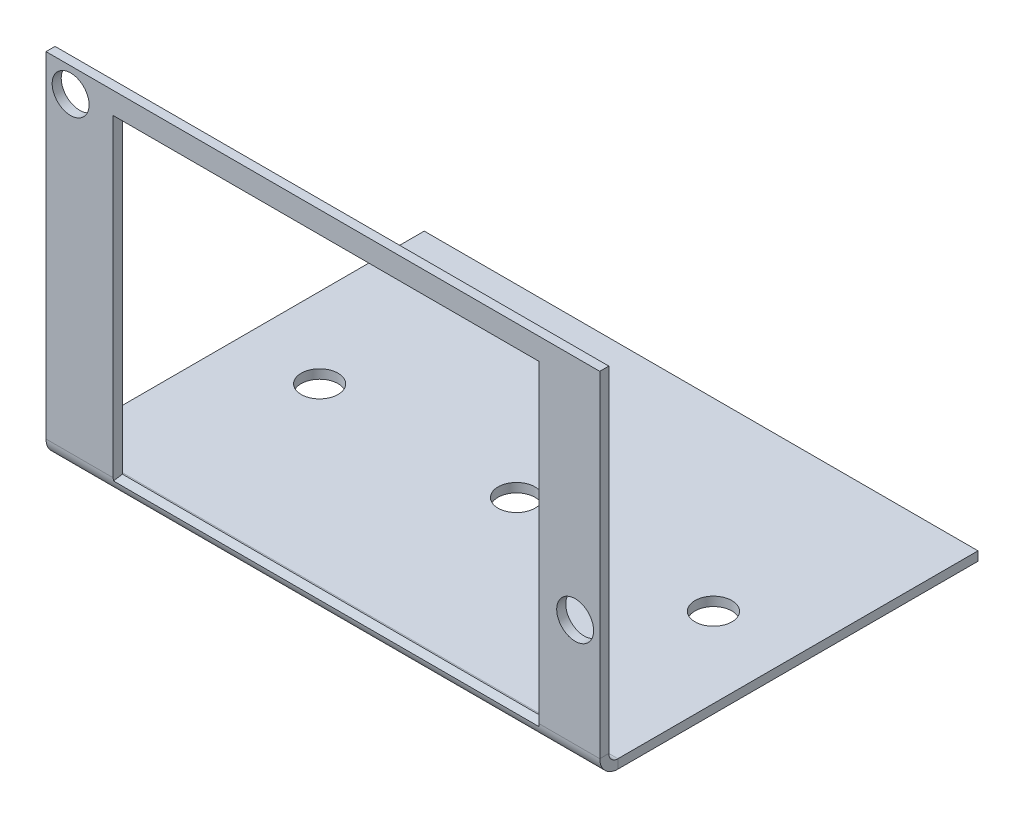
ISO-10303-21;
HEADER;
FILE_DESCRIPTION(('STEP AP214'),'2;1');
FILE_NAME('part.step','',(''),(''),'','','');
FILE_SCHEMA(('AUTOMOTIVE_DESIGN { 1 0 10303 214 1 1 1 1 }'));
ENDSEC;
DATA;
#1=APPLICATION_CONTEXT('core data for automotive mechanical design processes');
#2=APPLICATION_PROTOCOL_DEFINITION('international standard','automotive_design',2000,#1);
#3=PRODUCT_CONTEXT('',#1,'mechanical');
#4=PRODUCT('Part','Part','',(#3));
#5=PRODUCT_RELATED_PRODUCT_CATEGORY('part','',(#4));
#6=PRODUCT_DEFINITION_FORMATION('','',#4);
#7=PRODUCT_DEFINITION_CONTEXT('part definition',#1,'design');
#8=PRODUCT_DEFINITION('design','',#6,#7);
#9=PRODUCT_DEFINITION_SHAPE('','',#8);
#10=(LENGTH_UNIT() NAMED_UNIT(*) SI_UNIT(.MILLI.,.METRE.));
#11=(NAMED_UNIT(*) PLANE_ANGLE_UNIT() SI_UNIT($,.RADIAN.));
#12=(NAMED_UNIT(*) SI_UNIT($,.STERADIAN.) SOLID_ANGLE_UNIT());
#13=UNCERTAINTY_MEASURE_WITH_UNIT(LENGTH_MEASURE(1.E-05),#10,'distance_accuracy_value','');
#14=(GEOMETRIC_REPRESENTATION_CONTEXT(3) GLOBAL_UNCERTAINTY_ASSIGNED_CONTEXT((#13)) GLOBAL_UNIT_ASSIGNED_CONTEXT((#10,
#11,#12)) REPRESENTATION_CONTEXT('',''));
#15=CARTESIAN_POINT('',(0.,0.,0.));
#16=DIRECTION('',(0.,0.,1.));
#17=DIRECTION('',(1.,0.,0.));
#18=AXIS2_PLACEMENT_3D('',#15,#16,#17);
#19=CARTESIAN_POINT('',(22.4999999999999,0.7366,-0.7366));
#20=DIRECTION('',(-1.,0.,0.));
#21=DIRECTION('',(0.,0.,1.));
#22=AXIS2_PLACEMENT_3D('',#19,#20,#21);
#23=CYLINDRICAL_SURFACE('',#22,0.7366);
#24=DIRECTION('',(-1.,0.,0.));
#25=VECTOR('',#24,1.);
#26=CARTESIAN_POINT('',(22.4999999999999,0.7366,0.));
#27=LINE('',#26,#25);
#28=CARTESIAN_POINT('',(-17.0386854365852,0.7366,0.));
#29=VERTEX_POINT('',#28);
#30=CARTESIAN_POINT('',(-22.4999999999999,0.7366,0.));
#31=VERTEX_POINT('',#30);
#32=EDGE_CURVE('E338',#29,#31,#27,.T.);
#33=ORIENTED_EDGE('',*,*,#32,.F.);
#34=CARTESIAN_POINT('',(-17.0386854365852,0.7366,-0.7366));
#35=DIRECTION('',(1.,0.,0.));
#36=DIRECTION('',(0.,0.,1.));
#37=AXIS2_PLACEMENT_3D('',#34,#35,#36);
#38=CIRCLE('',#37,0.7366);
#39=CARTESIAN_POINT('',(-17.0386854365852,0.62129142966162,-0.00908127611275959));
#40=VERTEX_POINT('',#39);
#41=EDGE_CURVE('E209',#29,#40,#38,.T.);
#42=ORIENTED_EDGE('',*,*,#41,.T.);
#43=DIRECTION('',(1.,0.,0.));
#44=VECTOR('',#43,1.);
#45=CARTESIAN_POINT('',(17.5607864810594,0.62129142966162,-0.00908127611275948));
#46=LINE('',#45,#44);
#47=CARTESIAN_POINT('',(17.5607864810594,0.62129142966162,-0.00908127611275948));
#48=VERTEX_POINT('',#47);
#49=EDGE_CURVE('E218',#40,#48,#46,.T.);
#50=ORIENTED_EDGE('',*,*,#49,.T.);
#51=CARTESIAN_POINT('',(17.5607864810594,0.7366,-0.7366));
#52=DIRECTION('',(-1.,0.,0.));
#53=DIRECTION('',(0.,0.,-1.));
#54=AXIS2_PLACEMENT_3D('',#51,#52,#53);
#55=CIRCLE('',#54,0.7366);
#56=CARTESIAN_POINT('',(17.5607864810594,0.7366,0.));
#57=VERTEX_POINT('',#56);
#58=EDGE_CURVE('E180',#48,#57,#55,.T.);
#59=ORIENTED_EDGE('',*,*,#58,.T.);
#60=CARTESIAN_POINT('',(22.4999999999999,0.7366,0.));
#61=VERTEX_POINT('',#60);
#62=EDGE_CURVE('E339',#61,#57,#27,.T.);
#63=ORIENTED_EDGE('',*,*,#62,.F.);
#64=CARTESIAN_POINT('',(22.4999999999999,0.7366,-0.7366));
#65=DIRECTION('',(-1.,0.,0.));
#66=DIRECTION('',(0.,0.,1.));
#67=AXIS2_PLACEMENT_3D('',#64,#65,#66);
#68=CIRCLE('',#67,0.7366);
#69=CARTESIAN_POINT('',(22.4999999999999,0.,-0.7366));
#70=VERTEX_POINT('',#69);
#71=EDGE_CURVE('E274',#61,#70,#68,.F.);
#72=ORIENTED_EDGE('',*,*,#71,.T.);
#73=DIRECTION('',(-1.,0.,0.));
#74=VECTOR('',#73,1.);
#75=CARTESIAN_POINT('',(22.4999999999999,0.,-0.7366));
#76=LINE('',#75,#74);
#77=CARTESIAN_POINT('',(-22.4999999999999,0.,-0.7366));
#78=VERTEX_POINT('',#77);
#79=EDGE_CURVE('E342',#70,#78,#76,.T.);
#80=ORIENTED_EDGE('',*,*,#79,.T.);
#81=CARTESIAN_POINT('',(-22.4999999999999,0.7366,-0.7366));
#82=DIRECTION('',(-1.,0.,0.));
#83=DIRECTION('',(0.,0.,1.));
#84=AXIS2_PLACEMENT_3D('',#81,#82,#83);
#85=CIRCLE('',#84,0.7366);
#86=EDGE_CURVE('E306',#31,#78,#85,.F.);
#87=ORIENTED_EDGE('',*,*,#86,.F.);
#88=EDGE_LOOP('',(#33,#42,#50,#59,#63,#72,#80,#87));
#89=FACE_BOUND('',#88,.T.);
#90=ADVANCED_FACE('F48',(#89),#23,.F.);
#91=CARTESIAN_POINT('',(22.4999999999999,0.,0.));
#92=DIRECTION('',(0.,0.,-1.));
#93=DIRECTION('',(-1.,0.,0.));
#94=AXIS2_PLACEMENT_3D('',#91,#92,#93);
#95=PLANE('',#94);
#96=CARTESIAN_POINT('',(20.4999999999999,9.5,0.));
#97=DIRECTION('',(0.,0.,-1.));
#98=DIRECTION('',(-1.,0.,0.));
#99=AXIS2_PLACEMENT_3D('',#96,#97,#98);
#100=CIRCLE('',#99,1.5);
#101=CARTESIAN_POINT('',(18.9999999999999,9.5,0.));
#102=VERTEX_POINT('',#101);
#103=EDGE_CURVE('E252',#102,#102,#100,.T.);
#104=ORIENTED_EDGE('',*,*,#103,.F.);
#105=EDGE_LOOP('',(#104));
#106=FACE_BOUND('',#105,.T.);
#107=CARTESIAN_POINT('',(-20.5000000000001,26.,0.));
#108=DIRECTION('',(0.,0.,-1.));
#109=DIRECTION('',(-1.,0.,0.));
#110=AXIS2_PLACEMENT_3D('',#107,#108,#109);
#111=CIRCLE('',#110,1.5);
#112=CARTESIAN_POINT('',(-22.0000000000001,26.,0.));
#113=VERTEX_POINT('',#112);
#114=EDGE_CURVE('E235',#113,#113,#111,.T.);
#115=ORIENTED_EDGE('',*,*,#114,.F.);
#116=EDGE_LOOP('',(#115));
#117=FACE_BOUND('',#116,.T.);
#118=DIRECTION('',(-1.,0.,0.));
#119=VECTOR('',#118,1.);
#120=CARTESIAN_POINT('',(-19.7693427182926,26.2317350927219,0.));
#121=LINE('',#120,#119);
#122=CARTESIAN_POINT('',(-17.0386854365852,26.2317350927219,0.));
#123=VERTEX_POINT('',#122);
#124=CARTESIAN_POINT('',(17.5607864810594,26.2317350927219,0.));
#125=VERTEX_POINT('',#124);
#126=EDGE_CURVE('E155',#123,#125,#121,.F.);
#127=ORIENTED_EDGE('',*,*,#126,.F.);
#128=DIRECTION('',(0.,1.,0.));
#129=VECTOR('',#128,1.);
#130=CARTESIAN_POINT('',(-17.0386854365852,-0.131186430737841,0.));
#131=LINE('',#130,#129);
#132=EDGE_CURVE('E213',#29,#123,#131,.T.);
#133=ORIENTED_EDGE('',*,*,#132,.F.);
#134=ORIENTED_EDGE('',*,*,#32,.T.);
#135=DIRECTION('',(0.,-1.,0.));
#136=VECTOR('',#135,1.);
#137=CARTESIAN_POINT('',(-22.4999999999999,0.,0.));
#138=LINE('',#137,#136);
#139=CARTESIAN_POINT('',(-22.4999999999999,28.,0.));
#140=VERTEX_POINT('',#139);
#141=EDGE_CURVE('E310',#140,#31,#138,.T.);
#142=ORIENTED_EDGE('',*,*,#141,.F.);
#143=DIRECTION('',(-1.,0.,0.));
#144=VECTOR('',#143,1.);
#145=CARTESIAN_POINT('',(22.4999999999999,28.,0.));
#146=LINE('',#145,#144);
#147=CARTESIAN_POINT('',(22.4999999999999,28.,0.));
#148=VERTEX_POINT('',#147);
#149=EDGE_CURVE('E335',#148,#140,#146,.T.);
#150=ORIENTED_EDGE('',*,*,#149,.F.);
#151=DIRECTION('',(0.,-1.,0.));
#152=VECTOR('',#151,1.);
#153=CARTESIAN_POINT('',(22.4999999999999,0.,0.));
#154=LINE('',#153,#152);
#155=EDGE_CURVE('E278',#148,#61,#154,.T.);
#156=ORIENTED_EDGE('',*,*,#155,.T.);
#157=ORIENTED_EDGE('',*,*,#62,.T.);
#158=DIRECTION('',(0.,1.,0.));
#159=VECTOR('',#158,1.);
#160=CARTESIAN_POINT('',(17.5607864810594,-0.131186430737841,0.));
#161=LINE('',#160,#159);
#162=EDGE_CURVE('E174',#125,#57,#161,.F.);
#163=ORIENTED_EDGE('',*,*,#162,.F.);
#164=EDGE_LOOP('',(#127,#133,#134,#142,#150,#156,#157,#163));
#165=FACE_BOUND('',#164,.T.);
#166=ADVANCED_FACE('F372',(#106,#117,#165),#95,.T.);
#167=CARTESIAN_POINT('',(22.4999999999999,0.,0.7366));
#168=DIRECTION('',(0.,0.,-1.));
#169=DIRECTION('',(-1.,0.,0.));
#170=AXIS2_PLACEMENT_3D('',#167,#168,#169);
#171=PLANE('',#170);
#172=CARTESIAN_POINT('',(-20.5000000000001,26.,0.7366));
#173=DIRECTION('',(0.,0.,-1.));
#174=DIRECTION('',(-1.,0.,0.));
#175=AXIS2_PLACEMENT_3D('',#172,#173,#174);
#176=CIRCLE('',#175,1.5);
#177=CARTESIAN_POINT('',(-22.0000000000001,26.,0.7366));
#178=VERTEX_POINT('',#177);
#179=EDGE_CURVE('E256',#178,#178,#176,.T.);
#180=ORIENTED_EDGE('',*,*,#179,.T.);
#181=EDGE_LOOP('',(#180));
#182=FACE_BOUND('',#181,.T.);
#183=CARTESIAN_POINT('',(20.4999999999999,9.5,0.7366));
#184=DIRECTION('',(0.,0.,-1.));
#185=DIRECTION('',(-1.,0.,0.));
#186=AXIS2_PLACEMENT_3D('',#183,#184,#185);
#187=CIRCLE('',#186,1.5);
#188=CARTESIAN_POINT('',(18.9999999999999,9.5,0.7366));
#189=VERTEX_POINT('',#188);
#190=EDGE_CURVE('E247',#189,#189,#187,.T.);
#191=ORIENTED_EDGE('',*,*,#190,.T.);
#192=EDGE_LOOP('',(#191));
#193=FACE_BOUND('',#192,.T.);
#194=DIRECTION('',(0.,1.,0.));
#195=VECTOR('',#194,1.);
#196=CARTESIAN_POINT('',(-17.0386854365852,0.562922821678405,0.7366));
#197=LINE('',#196,#195);
#198=CARTESIAN_POINT('',(-17.0386854365852,0.7366,0.7366));
#199=VERTEX_POINT('',#198);
#200=CARTESIAN_POINT('',(-17.0386854365852,26.2317350927219,0.7366));
#201=VERTEX_POINT('',#200);
#202=EDGE_CURVE('E169',#199,#201,#197,.T.);
#203=ORIENTED_EDGE('',*,*,#202,.T.);
#204=DIRECTION('',(1.,0.,0.));
#205=VECTOR('',#204,1.);
#206=CARTESIAN_POINT('',(-17.0386854365852,26.2317350927219,0.7366));
#207=LINE('',#206,#205);
#208=CARTESIAN_POINT('',(17.5607864810594,26.2317350927219,0.7366));
#209=VERTEX_POINT('',#208);
#210=EDGE_CURVE('E152',#201,#209,#207,.T.);
#211=ORIENTED_EDGE('',*,*,#210,.T.);
#212=DIRECTION('',(0.,-1.,0.));
#213=VECTOR('',#212,1.);
#214=CARTESIAN_POINT('',(17.5607864810594,26.2317350927219,0.7366));
#215=LINE('',#214,#213);
#216=CARTESIAN_POINT('',(17.5607864810594,0.7366,0.7366));
#217=VERTEX_POINT('',#216);
#218=EDGE_CURVE('E161',#209,#217,#215,.T.);
#219=ORIENTED_EDGE('',*,*,#218,.T.);
#220=DIRECTION('',(-1.,0.,0.));
#221=VECTOR('',#220,1.);
#222=CARTESIAN_POINT('',(22.4999999999999,0.7366,0.7366));
#223=LINE('',#222,#221);
#224=CARTESIAN_POINT('',(22.4999999999999,0.7366,0.7366));
#225=VERTEX_POINT('',#224);
#226=EDGE_CURVE('E329',#225,#217,#223,.T.);
#227=ORIENTED_EDGE('',*,*,#226,.F.);
#228=DIRECTION('',(0.,1.,0.));
#229=VECTOR('',#228,1.);
#230=CARTESIAN_POINT('',(22.4999999999999,0.,0.7366));
#231=LINE('',#230,#229);
#232=CARTESIAN_POINT('',(22.4999999999999,28.,0.7366));
#233=VERTEX_POINT('',#232);
#234=EDGE_CURVE('E286',#233,#225,#231,.F.);
#235=ORIENTED_EDGE('',*,*,#234,.F.);
#236=DIRECTION('',(-1.,0.,0.));
#237=VECTOR('',#236,1.);
#238=CARTESIAN_POINT('',(22.4999999999999,28.,0.7366));
#239=LINE('',#238,#237);
#240=CARTESIAN_POINT('',(-22.4999999999999,28.,0.7366));
#241=VERTEX_POINT('',#240);
#242=EDGE_CURVE('E332',#233,#241,#239,.T.);
#243=ORIENTED_EDGE('',*,*,#242,.T.);
#244=DIRECTION('',(0.,1.,0.));
#245=VECTOR('',#244,1.);
#246=CARTESIAN_POINT('',(-22.4999999999999,0.,0.7366));
#247=LINE('',#246,#245);
#248=CARTESIAN_POINT('',(-22.4999999999999,0.7366,0.7366));
#249=VERTEX_POINT('',#248);
#250=EDGE_CURVE('E318',#241,#249,#247,.F.);
#251=ORIENTED_EDGE('',*,*,#250,.T.);
#252=EDGE_CURVE('E328',#199,#249,#223,.T.);
#253=ORIENTED_EDGE('',*,*,#252,.F.);
#254=EDGE_LOOP('',(#203,#211,#219,#227,#235,#243,#251,#253));
#255=FACE_BOUND('',#254,.T.);
#256=ADVANCED_FACE('F171',(#182,#193,#255),#171,.F.);
#257=CARTESIAN_POINT('',(22.4999999999999,0.7366,-0.7366));
#258=DIRECTION('',(-1.,0.,0.));
#259=DIRECTION('',(0.,0.,1.));
#260=AXIS2_PLACEMENT_3D('',#257,#258,#259);
#261=CYLINDRICAL_SURFACE('',#260,1.4732);
#262=CARTESIAN_POINT('',(-17.0386854365852,0.7366,-0.7366));
#263=DIRECTION('',(-1.,0.,0.));
#264=DIRECTION('',(0.,0.,1.));
#265=AXIS2_PLACEMENT_3D('',#262,#263,#264);
#266=CIRCLE('',#265,1.4732);
#267=CARTESIAN_POINT('',(-17.0386854365852,0.505982859323239,0.718437447774481));
#268=VERTEX_POINT('',#267);
#269=EDGE_CURVE('E199',#199,#268,#266,.F.);
#270=ORIENTED_EDGE('',*,*,#269,.F.);
#271=ORIENTED_EDGE('',*,*,#252,.T.);
#272=CARTESIAN_POINT('',(-22.4999999999999,0.7366,-0.7366));
#273=DIRECTION('',(1.,0.,0.));
#274=DIRECTION('',(0.,0.,-1.));
#275=AXIS2_PLACEMENT_3D('',#272,#273,#274);
#276=CIRCLE('',#275,1.4732);
#277=CARTESIAN_POINT('',(-22.4999999999999,-0.7366,-0.7366));
#278=VERTEX_POINT('',#277);
#279=EDGE_CURVE('E267',#249,#278,#276,.T.);
#280=ORIENTED_EDGE('',*,*,#279,.T.);
#281=DIRECTION('',(-1.,0.,0.));
#282=VECTOR('',#281,1.);
#283=CARTESIAN_POINT('',(22.4999999999999,-0.7366,-0.7366));
#284=LINE('',#283,#282);
#285=CARTESIAN_POINT('',(22.4999999999999,-0.7366,-0.7366));
#286=VERTEX_POINT('',#285);
#287=EDGE_CURVE('E294',#286,#278,#284,.T.);
#288=ORIENTED_EDGE('',*,*,#287,.F.);
#289=CARTESIAN_POINT('',(22.4999999999999,0.7366,-0.7366));
#290=DIRECTION('',(1.,0.,0.));
#291=DIRECTION('',(0.,0.,-1.));
#292=AXIS2_PLACEMENT_3D('',#289,#290,#291);
#293=CIRCLE('',#292,1.4732);
#294=EDGE_CURVE('E290',#225,#286,#293,.T.);
#295=ORIENTED_EDGE('',*,*,#294,.F.);
#296=ORIENTED_EDGE('',*,*,#226,.T.);
#297=CARTESIAN_POINT('',(17.5607864810594,0.7366,-0.7366));
#298=DIRECTION('',(-1.,0.,0.));
#299=DIRECTION('',(0.,0.,1.));
#300=AXIS2_PLACEMENT_3D('',#297,#298,#299);
#301=CIRCLE('',#300,1.4732);
#302=CARTESIAN_POINT('',(17.5607864810594,0.505982859323239,0.718437447774481));
#303=VERTEX_POINT('',#302);
#304=EDGE_CURVE('E164',#303,#217,#301,.T.);
#305=ORIENTED_EDGE('',*,*,#304,.F.);
#306=DIRECTION('',(-1.,0.,0.));
#307=VECTOR('',#306,1.);
#308=CARTESIAN_POINT('',(65.069873618499,0.505982859323239,0.718437447774481));
#309=LINE('',#308,#307);
#310=EDGE_CURVE('E72',#268,#303,#309,.F.);
#311=ORIENTED_EDGE('',*,*,#310,.F.);
#312=EDGE_LOOP('',(#270,#271,#280,#288,#295,#296,#305,#311));
#313=FACE_BOUND('',#312,.T.);
#314=ADVANCED_FACE('F382',(#313),#261,.T.);
#315=CARTESIAN_POINT('',(22.4999999999999,0.,-0.7366));
#316=DIRECTION('',(1.,0.,0.));
#317=DIRECTION('',(0.,0.,-1.));
#318=AXIS2_PLACEMENT_3D('',#315,#316,#317);
#319=PLANE('',#318);
#320=DIRECTION('',(0.,-1.,0.));
#321=VECTOR('',#320,1.);
#322=CARTESIAN_POINT('',(22.4999999999999,0.,-0.7366));
#323=LINE('',#322,#321);
#324=EDGE_CURVE('E11',#70,#286,#323,.T.);
#325=ORIENTED_EDGE('',*,*,#324,.F.);
#326=ORIENTED_EDGE('',*,*,#71,.F.);
#327=DIRECTION('',(0.,0.,-1.));
#328=VECTOR('',#327,1.);
#329=CARTESIAN_POINT('',(22.4999999999999,0.7366,0.7366));
#330=LINE('',#329,#328);
#331=EDGE_CURVE('E57',#225,#61,#330,.T.);
#332=ORIENTED_EDGE('',*,*,#331,.F.);
#333=ORIENTED_EDGE('',*,*,#294,.T.);
#334=EDGE_LOOP('',(#325,#326,#332,#333));
#335=FACE_BOUND('',#334,.T.);
#336=ADVANCED_FACE('F50',(#335),#319,.T.);
#337=CARTESIAN_POINT('',(22.4999999999999,0.7366,0.7366));
#338=DIRECTION('',(1.,0.,0.));
#339=DIRECTION('',(0.,0.,-1.));
#340=AXIS2_PLACEMENT_3D('',#337,#338,#339);
#341=PLANE('',#340);
#342=DIRECTION('',(0.,0.,-1.));
#343=VECTOR('',#342,1.);
#344=CARTESIAN_POINT('',(22.4999999999999,0.,0.));
#345=LINE('',#344,#343);
#346=CARTESIAN_POINT('',(22.4999999999999,0.,-30.));
#347=VERTEX_POINT('',#346);
#348=EDGE_CURVE('E270',#70,#347,#345,.T.);
#349=ORIENTED_EDGE('',*,*,#348,.F.);
#350=ORIENTED_EDGE('',*,*,#324,.T.);
#351=DIRECTION('',(0.,0.,-1.));
#352=VECTOR('',#351,1.);
#353=CARTESIAN_POINT('',(22.4999999999999,-0.7366,0.));
#354=LINE('',#353,#352);
#355=CARTESIAN_POINT('',(22.4999999999999,-0.7366,-30.));
#356=VERTEX_POINT('',#355);
#357=EDGE_CURVE('E263',#286,#356,#354,.T.);
#358=ORIENTED_EDGE('',*,*,#357,.T.);
#359=DIRECTION('',(0.,-1.,0.));
#360=VECTOR('',#359,1.);
#361=CARTESIAN_POINT('',(22.4999999999999,0.,-30.));
#362=LINE('',#361,#360);
#363=EDGE_CURVE('E266',#347,#356,#362,.T.);
#364=ORIENTED_EDGE('',*,*,#363,.F.);
#365=EDGE_LOOP('',(#349,#350,#358,#364));
#366=FACE_BOUND('',#365,.T.);
#367=ADVANCED_FACE('F392',(#366),#341,.T.);
#368=CARTESIAN_POINT('',(-22.4999999999999,0.7366,0.));
#369=DIRECTION('',(-1.,0.,0.));
#370=DIRECTION('',(0.,0.,1.));
#371=AXIS2_PLACEMENT_3D('',#368,#369,#370);
#372=PLANE('',#371);
#373=DIRECTION('',(0.,0.,1.));
#374=VECTOR('',#373,1.);
#375=CARTESIAN_POINT('',(-22.4999999999999,0.7366,0.));
#376=LINE('',#375,#374);
#377=EDGE_CURVE('E355',#31,#249,#376,.T.);
#378=ORIENTED_EDGE('',*,*,#377,.F.);
#379=ORIENTED_EDGE('',*,*,#86,.T.);
#380=DIRECTION('',(0.,1.,0.));
#381=VECTOR('',#380,1.);
#382=CARTESIAN_POINT('',(-22.4999999999999,-0.7366,-0.7366));
#383=LINE('',#382,#381);
#384=EDGE_CURVE('E352',#278,#78,#383,.T.);
#385=ORIENTED_EDGE('',*,*,#384,.F.);
#386=ORIENTED_EDGE('',*,*,#279,.F.);
#387=EDGE_LOOP('',(#378,#379,#385,#386));
#388=FACE_BOUND('',#387,.T.);
#389=ADVANCED_FACE('F402',(#388),#372,.T.);
#390=CARTESIAN_POINT('',(-22.4999999999999,-0.7366,-0.7366));
#391=DIRECTION('',(-1.,0.,0.));
#392=DIRECTION('',(0.,0.,1.));
#393=AXIS2_PLACEMENT_3D('',#390,#391,#392);
#394=PLANE('',#393);
#395=ORIENTED_EDGE('',*,*,#141,.T.);
#396=ORIENTED_EDGE('',*,*,#377,.T.);
#397=ORIENTED_EDGE('',*,*,#250,.F.);
#398=DIRECTION('',(0.,0.,-1.));
#399=VECTOR('',#398,1.);
#400=CARTESIAN_POINT('',(-22.4999999999999,28.,0.7366));
#401=LINE('',#400,#399);
#402=EDGE_CURVE('E314',#241,#140,#401,.T.);
#403=ORIENTED_EDGE('',*,*,#402,.T.);
#404=EDGE_LOOP('',(#395,#396,#397,#403));
#405=FACE_BOUND('',#404,.T.);
#406=ADVANCED_FACE('F401',(#405),#394,.T.);
#407=CARTESIAN_POINT('',(22.4999999999999,-0.7366,0.));
#408=DIRECTION('',(0.,1.,0.));
#409=DIRECTION('',(0.,0.,1.));
#410=AXIS2_PLACEMENT_3D('',#407,#408,#409);
#411=PLANE('',#410);
#412=CARTESIAN_POINT('',(16.0000000000001,-0.7366,-15.));
#413=DIRECTION('',(0.,-1.,0.));
#414=DIRECTION('',(0.,0.,1.));
#415=AXIS2_PLACEMENT_3D('',#412,#413,#414);
#416=CIRCLE('',#415,1.5);
#417=CARTESIAN_POINT('',(16.0000000000001,-0.7366,-13.5));
#418=VERTEX_POINT('',#417);
#419=EDGE_CURVE('E223',#418,#418,#416,.T.);
#420=ORIENTED_EDGE('',*,*,#419,.F.);
#421=EDGE_LOOP('',(#420));
#422=FACE_BOUND('',#421,.T.);
#423=CARTESIAN_POINT('',(0.,-0.7366,-15.));
#424=DIRECTION('',(0.,1.,0.));
#425=DIRECTION('',(0.,0.,1.));
#426=AXIS2_PLACEMENT_3D('',#423,#424,#425);
#427=CIRCLE('',#426,1.5);
#428=CARTESIAN_POINT('',(0.,-0.7366,-13.5));
#429=VERTEX_POINT('',#428);
#430=EDGE_CURVE('E231',#429,#429,#427,.T.);
#431=ORIENTED_EDGE('',*,*,#430,.T.);
#432=EDGE_LOOP('',(#431));
#433=FACE_BOUND('',#432,.T.);
#434=CARTESIAN_POINT('',(-16.0000000000001,-0.7366,-15.));
#435=DIRECTION('',(0.,1.,0.));
#436=DIRECTION('',(0.,0.,1.));
#437=AXIS2_PLACEMENT_3D('',#434,#435,#436);
#438=CIRCLE('',#437,1.5);
#439=CARTESIAN_POINT('',(-16.0000000000001,-0.7366,-13.5));
#440=VERTEX_POINT('',#439);
#441=EDGE_CURVE('E240',#440,#440,#438,.T.);
#442=ORIENTED_EDGE('',*,*,#441,.T.);
#443=EDGE_LOOP('',(#442));
#444=FACE_BOUND('',#443,.T.);
#445=DIRECTION('',(0.,0.,-1.));
#446=VECTOR('',#445,1.);
#447=CARTESIAN_POINT('',(-22.4999999999999,-0.7366,0.));
#448=LINE('',#447,#446);
#449=CARTESIAN_POINT('',(-22.4999999999999,-0.7366,-30.));
#450=VERTEX_POINT('',#449);
#451=EDGE_CURVE('E251',#278,#450,#448,.T.);
#452=ORIENTED_EDGE('',*,*,#451,.T.);
#453=DIRECTION('',(-1.,0.,0.));
#454=VECTOR('',#453,1.);
#455=CARTESIAN_POINT('',(22.4999999999999,-0.7366,-30.));
#456=LINE('',#455,#454);
#457=EDGE_CURVE('E349',#356,#450,#456,.T.);
#458=ORIENTED_EDGE('',*,*,#457,.F.);
#459=ORIENTED_EDGE('',*,*,#357,.F.);
#460=ORIENTED_EDGE('',*,*,#287,.T.);
#461=EDGE_LOOP('',(#452,#458,#459,#460));
#462=FACE_BOUND('',#461,.T.);
#463=ADVANCED_FACE('F388',(#422,#433,#444,#462),#411,.F.);
#464=CARTESIAN_POINT('',(22.4999999999999,0.,-30.));
#465=DIRECTION('',(0.,0.,-1.));
#466=DIRECTION('',(-1.,0.,0.));
#467=AXIS2_PLACEMENT_3D('',#464,#465,#466);
#468=PLANE('',#467);
#469=DIRECTION('',(0.,-1.,0.));
#470=VECTOR('',#469,1.);
#471=CARTESIAN_POINT('',(-22.4999999999999,0.,-30.));
#472=LINE('',#471,#470);
#473=CARTESIAN_POINT('',(-22.4999999999999,0.,-30.));
#474=VERTEX_POINT('',#473);
#475=EDGE_CURVE('E298',#474,#450,#472,.T.);
#476=ORIENTED_EDGE('',*,*,#475,.F.);
#477=DIRECTION('',(-1.,0.,0.));
#478=VECTOR('',#477,1.);
#479=CARTESIAN_POINT('',(22.4999999999999,0.,-30.));
#480=LINE('',#479,#478);
#481=EDGE_CURVE('E346',#347,#474,#480,.T.);
#482=ORIENTED_EDGE('',*,*,#481,.F.);
#483=ORIENTED_EDGE('',*,*,#363,.T.);
#484=ORIENTED_EDGE('',*,*,#457,.T.);
#485=EDGE_LOOP('',(#476,#482,#483,#484));
#486=FACE_BOUND('',#485,.T.);
#487=ADVANCED_FACE('F406',(#486),#468,.T.);
#488=CARTESIAN_POINT('',(22.4999999999999,0.,0.));
#489=DIRECTION('',(0.,1.,0.));
#490=DIRECTION('',(0.,0.,1.));
#491=AXIS2_PLACEMENT_3D('',#488,#489,#490);
#492=PLANE('',#491);
#493=CARTESIAN_POINT('',(16.0000000000001,0.,-15.));
#494=DIRECTION('',(0.,-1.,0.));
#495=DIRECTION('',(0.,0.,1.));
#496=AXIS2_PLACEMENT_3D('',#493,#494,#495);
#497=CIRCLE('',#496,1.5);
#498=CARTESIAN_POINT('',(16.0000000000001,0.,-13.5));
#499=VERTEX_POINT('',#498);
#500=EDGE_CURVE('E222',#499,#499,#497,.T.);
#501=ORIENTED_EDGE('',*,*,#500,.T.);
#502=EDGE_LOOP('',(#501));
#503=FACE_BOUND('',#502,.T.);
#504=CARTESIAN_POINT('',(0.,0.,-15.));
#505=DIRECTION('',(0.,1.,0.));
#506=DIRECTION('',(0.,0.,1.));
#507=AXIS2_PLACEMENT_3D('',#504,#505,#506);
#508=CIRCLE('',#507,1.5);
#509=CARTESIAN_POINT('',(0.,0.,-13.5));
#510=VERTEX_POINT('',#509);
#511=EDGE_CURVE('E236',#510,#510,#508,.T.);
#512=ORIENTED_EDGE('',*,*,#511,.F.);
#513=EDGE_LOOP('',(#512));
#514=FACE_BOUND('',#513,.T.);
#515=CARTESIAN_POINT('',(-16.0000000000001,0.,-15.));
#516=DIRECTION('',(0.,1.,0.));
#517=DIRECTION('',(0.,0.,1.));
#518=AXIS2_PLACEMENT_3D('',#515,#516,#517);
#519=CIRCLE('',#518,1.5);
#520=CARTESIAN_POINT('',(-16.0000000000001,0.,-13.5));
#521=VERTEX_POINT('',#520);
#522=EDGE_CURVE('E227',#521,#521,#519,.T.);
#523=ORIENTED_EDGE('',*,*,#522,.F.);
#524=EDGE_LOOP('',(#523));
#525=FACE_BOUND('',#524,.T.);
#526=DIRECTION('',(0.,0.,-1.));
#527=VECTOR('',#526,1.);
#528=CARTESIAN_POINT('',(-22.4999999999999,0.,0.));
#529=LINE('',#528,#527);
#530=EDGE_CURVE('E302',#78,#474,#529,.T.);
#531=ORIENTED_EDGE('',*,*,#530,.F.);
#532=ORIENTED_EDGE('',*,*,#79,.F.);
#533=ORIENTED_EDGE('',*,*,#348,.T.);
#534=ORIENTED_EDGE('',*,*,#481,.T.);
#535=EDGE_LOOP('',(#531,#532,#533,#534));
#536=FACE_BOUND('',#535,.T.);
#537=ADVANCED_FACE('F395',(#503,#514,#525,#536),#492,.T.);
#538=CARTESIAN_POINT('',(22.4999999999999,28.,0.7366));
#539=DIRECTION('',(0.,1.,0.));
#540=DIRECTION('',(0.,0.,1.));
#541=AXIS2_PLACEMENT_3D('',#538,#539,#540);
#542=PLANE('',#541);
#543=ORIENTED_EDGE('',*,*,#402,.F.);
#544=ORIENTED_EDGE('',*,*,#242,.F.);
#545=DIRECTION('',(0.,0.,-1.));
#546=VECTOR('',#545,1.);
#547=CARTESIAN_POINT('',(22.4999999999999,28.,0.7366));
#548=LINE('',#547,#546);
#549=EDGE_CURVE('E282',#233,#148,#548,.T.);
#550=ORIENTED_EDGE('',*,*,#549,.T.);
#551=ORIENTED_EDGE('',*,*,#149,.T.);
#552=EDGE_LOOP('',(#543,#544,#550,#551));
#553=FACE_BOUND('',#552,.T.);
#554=ADVANCED_FACE('F376',(#553),#542,.T.);
#555=CARTESIAN_POINT('',(22.4999999999999,0.7366,-0.7366));
#556=DIRECTION('',(-1.,0.,0.));
#557=DIRECTION('',(0.,0.,1.));
#558=AXIS2_PLACEMENT_3D('',#555,#556,#557);
#559=PLANE('',#558);
#560=ORIENTED_EDGE('',*,*,#234,.T.);
#561=ORIENTED_EDGE('',*,*,#331,.T.);
#562=ORIENTED_EDGE('',*,*,#155,.F.);
#563=ORIENTED_EDGE('',*,*,#549,.F.);
#564=EDGE_LOOP('',(#560,#561,#562,#563));
#565=FACE_BOUND('',#564,.T.);
#566=ADVANCED_FACE('F363',(#565),#559,.F.);
#567=CARTESIAN_POINT('',(-22.4999999999999,0.7366,-0.7366));
#568=DIRECTION('',(-1.,0.,0.));
#569=DIRECTION('',(0.,0.,1.));
#570=AXIS2_PLACEMENT_3D('',#567,#568,#569);
#571=PLANE('',#570);
#572=ORIENTED_EDGE('',*,*,#451,.F.);
#573=ORIENTED_EDGE('',*,*,#384,.T.);
#574=ORIENTED_EDGE('',*,*,#530,.T.);
#575=ORIENTED_EDGE('',*,*,#475,.T.);
#576=EDGE_LOOP('',(#572,#573,#574,#575));
#577=FACE_BOUND('',#576,.T.);
#578=ADVANCED_FACE('F404',(#577),#571,.T.);
#579=CARTESIAN_POINT('',(-20.5000000000001,26.,0.7366));
#580=DIRECTION('',(0.,0.,-1.));
#581=DIRECTION('',(-1.,0.,0.));
#582=AXIS2_PLACEMENT_3D('',#579,#580,#581);
#583=CYLINDRICAL_SURFACE('',#582,1.5);
#584=ORIENTED_EDGE('',*,*,#179,.F.);
#585=EDGE_LOOP('',(#584));
#586=FACE_BOUND('',#585,.T.);
#587=ORIENTED_EDGE('',*,*,#114,.T.);
#588=EDGE_LOOP('',(#587));
#589=FACE_BOUND('',#588,.T.);
#590=ADVANCED_FACE('F434',(#586,#589),#583,.F.);
#591=CARTESIAN_POINT('',(20.4999999999999,9.5,0.7366));
#592=DIRECTION('',(0.,0.,-1.));
#593=DIRECTION('',(-1.,0.,0.));
#594=AXIS2_PLACEMENT_3D('',#591,#592,#593);
#595=CYLINDRICAL_SURFACE('',#594,1.5);
#596=ORIENTED_EDGE('',*,*,#190,.F.);
#597=EDGE_LOOP('',(#596));
#598=FACE_BOUND('',#597,.T.);
#599=ORIENTED_EDGE('',*,*,#103,.T.);
#600=EDGE_LOOP('',(#599));
#601=FACE_BOUND('',#600,.T.);
#602=ADVANCED_FACE('F439',(#598,#601),#595,.F.);
#603=CARTESIAN_POINT('',(-16.0000000000001,-0.7366,-15.));
#604=DIRECTION('',(0.,1.,0.));
#605=DIRECTION('',(0.,0.,1.));
#606=AXIS2_PLACEMENT_3D('',#603,#604,#605);
#607=CYLINDRICAL_SURFACE('',#606,1.5);
#608=ORIENTED_EDGE('',*,*,#441,.F.);
#609=EDGE_LOOP('',(#608));
#610=FACE_BOUND('',#609,.T.);
#611=ORIENTED_EDGE('',*,*,#522,.T.);
#612=EDGE_LOOP('',(#611));
#613=FACE_BOUND('',#612,.T.);
#614=ADVANCED_FACE('F443',(#610,#613),#607,.F.);
#615=CARTESIAN_POINT('',(0.,-0.7366,-15.));
#616=DIRECTION('',(0.,1.,0.));
#617=DIRECTION('',(0.,0.,1.));
#618=AXIS2_PLACEMENT_3D('',#615,#616,#617);
#619=CYLINDRICAL_SURFACE('',#618,1.5);
#620=ORIENTED_EDGE('',*,*,#430,.F.);
#621=EDGE_LOOP('',(#620));
#622=FACE_BOUND('',#621,.T.);
#623=ORIENTED_EDGE('',*,*,#511,.T.);
#624=EDGE_LOOP('',(#623));
#625=FACE_BOUND('',#624,.T.);
#626=ADVANCED_FACE('F447',(#622,#625),#619,.F.);
#627=CARTESIAN_POINT('',(16.0000000000001,-0.7366,-15.));
#628=DIRECTION('',(0.,1.,0.));
#629=DIRECTION('',(0.,0.,1.));
#630=AXIS2_PLACEMENT_3D('',#627,#628,#629);
#631=CYLINDRICAL_SURFACE('',#630,1.5);
#632=ORIENTED_EDGE('',*,*,#419,.T.);
#633=EDGE_LOOP('',(#632));
#634=FACE_BOUND('',#633,.T.);
#635=ORIENTED_EDGE('',*,*,#500,.F.);
#636=EDGE_LOOP('',(#635));
#637=FACE_BOUND('',#636,.T.);
#638=ADVANCED_FACE('F451',(#634,#637),#631,.F.);
#639=CARTESIAN_POINT('',(0.261050522237127,0.62129142966162,-0.00908127611275953));
#640=DIRECTION('',(0.,-0.987671360151019,-0.156541637711621));
#641=DIRECTION('',(1.,0.,0.));
#642=AXIS2_PLACEMENT_3D('',#639,#640,#641);
#643=PLANE('',#642);
#644=DIRECTION('',(0.,0.156541637711622,-0.987671360151019));
#645=VECTOR('',#644,1.);
#646=CARTESIAN_POINT('',(-17.0386854365852,0.62129142966162,-0.00908127611275959));
#647=LINE('',#646,#645);
#648=EDGE_CURVE('E205',#268,#40,#647,.T.);
#649=ORIENTED_EDGE('',*,*,#648,.F.);
#650=ORIENTED_EDGE('',*,*,#310,.T.);
#651=DIRECTION('',(0.,0.156541637711621,-0.987671360151019));
#652=VECTOR('',#651,1.);
#653=CARTESIAN_POINT('',(17.5607864810594,0.62129142966162,-0.00908127611275948));
#654=LINE('',#653,#652);
#655=EDGE_CURVE('E190',#303,#48,#654,.T.);
#656=ORIENTED_EDGE('',*,*,#655,.T.);
#657=ORIENTED_EDGE('',*,*,#49,.F.);
#658=EDGE_LOOP('',(#649,#650,#656,#657));
#659=FACE_BOUND('',#658,.T.);
#660=ADVANCED_FACE('F455',(#659),#643,.F.);
#661=CARTESIAN_POINT('',(-17.0386854365852,0.562922821678405,0.7366));
#662=DIRECTION('',(-1.,0.,0.));
#663=DIRECTION('',(0.,1.,0.));
#664=AXIS2_PLACEMENT_3D('',#661,#662,#663);
#665=PLANE('',#664);
#666=ORIENTED_EDGE('',*,*,#202,.F.);
#667=ORIENTED_EDGE('',*,*,#269,.T.);
#668=ORIENTED_EDGE('',*,*,#648,.T.);
#669=ORIENTED_EDGE('',*,*,#41,.F.);
#670=ORIENTED_EDGE('',*,*,#132,.T.);
#671=DIRECTION('',(0.,0.,-1.));
#672=VECTOR('',#671,1.);
#673=CARTESIAN_POINT('',(-17.0386854365852,26.2317350927219,0.7366));
#674=LINE('',#673,#672);
#675=EDGE_CURVE('E64',#123,#201,#674,.F.);
#676=ORIENTED_EDGE('',*,*,#675,.T.);
#677=EDGE_LOOP('',(#666,#667,#668,#669,#670,#676));
#678=FACE_BOUND('',#677,.T.);
#679=ADVANCED_FACE('F459',(#678),#665,.F.);
#680=CARTESIAN_POINT('',(17.5607864810594,26.2317350927219,0.7366));
#681=DIRECTION('',(1.,0.,0.));
#682=DIRECTION('',(0.,-1.,0.));
#683=AXIS2_PLACEMENT_3D('',#680,#681,#682);
#684=PLANE('',#683);
#685=ORIENTED_EDGE('',*,*,#162,.T.);
#686=ORIENTED_EDGE('',*,*,#58,.F.);
#687=ORIENTED_EDGE('',*,*,#655,.F.);
#688=ORIENTED_EDGE('',*,*,#304,.T.);
#689=ORIENTED_EDGE('',*,*,#218,.F.);
#690=DIRECTION('',(0.,0.,-1.));
#691=VECTOR('',#690,1.);
#692=CARTESIAN_POINT('',(17.5607864810594,26.2317350927219,0.7366));
#693=LINE('',#692,#691);
#694=EDGE_CURVE('E148',#125,#209,#693,.F.);
#695=ORIENTED_EDGE('',*,*,#694,.F.);
#696=EDGE_LOOP('',(#685,#686,#687,#688,#689,#695));
#697=FACE_BOUND('',#696,.T.);
#698=ADVANCED_FACE('F162',(#697),#684,.F.);
#699=CARTESIAN_POINT('',(-17.0386854365852,26.2317350927219,0.7366));
#700=DIRECTION('',(0.,1.,0.));
#701=DIRECTION('',(1.,0.,0.));
#702=AXIS2_PLACEMENT_3D('',#699,#700,#701);
#703=PLANE('',#702);
#704=ORIENTED_EDGE('',*,*,#675,.F.);
#705=ORIENTED_EDGE('',*,*,#126,.T.);
#706=ORIENTED_EDGE('',*,*,#694,.T.);
#707=ORIENTED_EDGE('',*,*,#210,.F.);
#708=EDGE_LOOP('',(#704,#705,#706,#707));
#709=FACE_BOUND('',#708,.T.);
#710=ADVANCED_FACE('F150',(#709),#703,.F.);
#711=CLOSED_SHELL('',(#90,#166,#256,#314,#336,#367,#389,#406,#463,#487,#537,#554,#566,#578,#590,
#602,#614,#626,#638,#660,#679,#698,#710));
#712=MANIFOLD_SOLID_BREP('B2',#711);
#713=ADVANCED_BREP_SHAPE_REPRESENTATION('',(#18,#712),#14);
#714=SHAPE_DEFINITION_REPRESENTATION(#9,#713);
ENDSEC;
END-ISO-10303-21;
